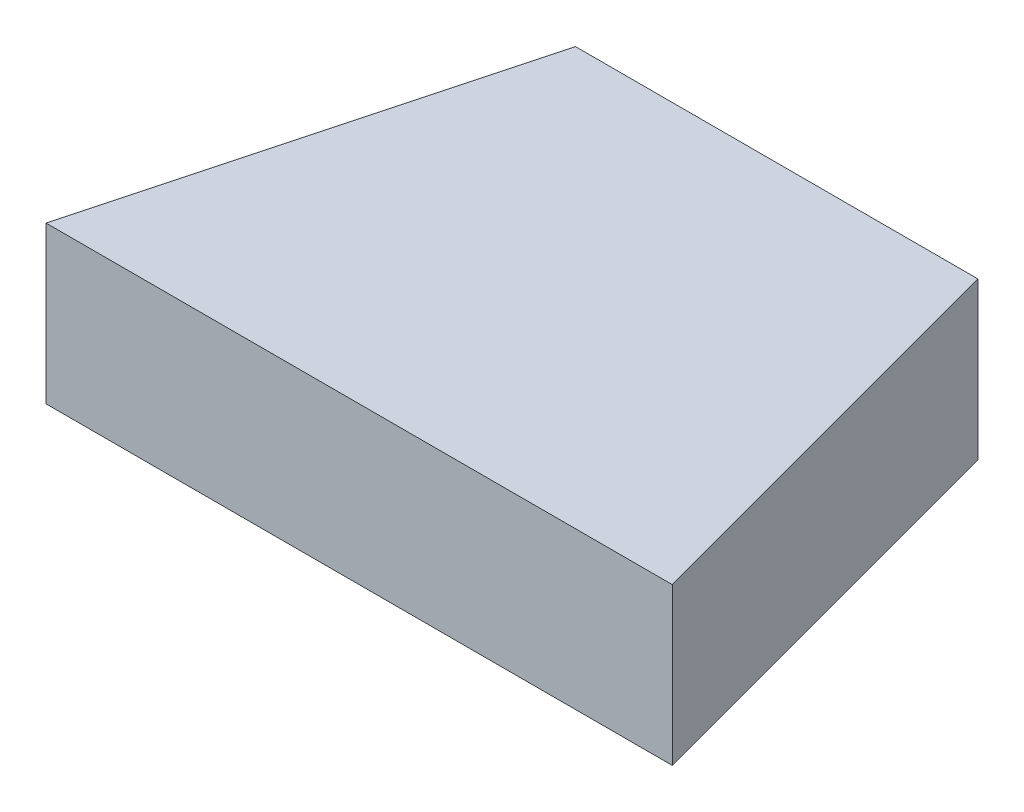
ISO-10303-21;
HEADER;
FILE_DESCRIPTION(('STEP AP214'),'2;1');
FILE_NAME('part.step','',(''),(''),'','','');
FILE_SCHEMA(('AUTOMOTIVE_DESIGN { 1 0 10303 214 1 1 1 1 }'));
ENDSEC;
DATA;
#1=APPLICATION_CONTEXT('core data for automotive mechanical design processes');
#2=APPLICATION_PROTOCOL_DEFINITION('international standard','automotive_design',2000,#1);
#3=PRODUCT_CONTEXT('',#1,'mechanical');
#4=PRODUCT('Part','Part','',(#3));
#5=PRODUCT_RELATED_PRODUCT_CATEGORY('part','',(#4));
#6=PRODUCT_DEFINITION_FORMATION('','',#4);
#7=PRODUCT_DEFINITION_CONTEXT('part definition',#1,'design');
#8=PRODUCT_DEFINITION('design','',#6,#7);
#9=PRODUCT_DEFINITION_SHAPE('','',#8);
#10=(LENGTH_UNIT() NAMED_UNIT(*) SI_UNIT(.MILLI.,.METRE.));
#11=(NAMED_UNIT(*) PLANE_ANGLE_UNIT() SI_UNIT($,.RADIAN.));
#12=(NAMED_UNIT(*) SI_UNIT($,.STERADIAN.) SOLID_ANGLE_UNIT());
#13=UNCERTAINTY_MEASURE_WITH_UNIT(LENGTH_MEASURE(1.E-05),#10,'distance_accuracy_value','');
#14=(GEOMETRIC_REPRESENTATION_CONTEXT(3) GLOBAL_UNCERTAINTY_ASSIGNED_CONTEXT((#13)) GLOBAL_UNIT_ASSIGNED_CONTEXT((#10,
#11,#12)) REPRESENTATION_CONTEXT('',''));
#15=CARTESIAN_POINT('',(0.,0.,0.));
#16=DIRECTION('',(0.,0.,1.));
#17=DIRECTION('',(1.,0.,0.));
#18=AXIS2_PLACEMENT_3D('',#15,#16,#17);
#19=CARTESIAN_POINT('',(-24.4881810244989,19.05,91.3911357683743));
#20=DIRECTION('',(0.965925826289068,0.,0.258819045102522));
#21=DIRECTION('',(0.258819045102522,0.,-0.965925826289068));
#22=AXIS2_PLACEMENT_3D('',#19,#20,#21);
#23=PLANE('',#22);
#24=DIRECTION('',(-0.258819045102522,0.,0.965925826289068));
#25=VECTOR('',#24,1.);
#26=CARTESIAN_POINT('',(-24.4881810244989,0.,91.3911357683743));
#27=LINE('',#26,#25);
#28=CARTESIAN_POINT('',(-24.4881810244989,0.,91.3911357683743));
#29=VERTEX_POINT('',#28);
#30=CARTESIAN_POINT('',(-38.1,0.,142.191135768374));
#31=VERTEX_POINT('',#30);
#32=EDGE_CURVE('E96',#29,#31,#27,.T.);
#33=ORIENTED_EDGE('',*,*,#32,.T.);
#34=DIRECTION('',(0.,-1.,0.));
#35=VECTOR('',#34,1.);
#36=CARTESIAN_POINT('',(-38.1,19.05,142.191135768374));
#37=LINE('',#36,#35);
#38=CARTESIAN_POINT('',(-38.1,19.05,142.191135768374));
#39=VERTEX_POINT('',#38);
#40=EDGE_CURVE('E11',#39,#31,#37,.T.);
#41=ORIENTED_EDGE('',*,*,#40,.F.);
#42=DIRECTION('',(-0.258819045102522,0.,0.965925826289068));
#43=VECTOR('',#42,1.);
#44=CARTESIAN_POINT('',(-24.4881810244989,19.05,91.3911357683743));
#45=LINE('',#44,#43);
#46=CARTESIAN_POINT('',(-24.4881810244989,19.05,91.3911357683743));
#47=VERTEX_POINT('',#46);
#48=EDGE_CURVE('E84',#47,#39,#45,.T.);
#49=ORIENTED_EDGE('',*,*,#48,.F.);
#50=DIRECTION('',(0.,-1.,0.));
#51=VECTOR('',#50,1.);
#52=CARTESIAN_POINT('',(-24.4881810244989,19.05,91.3911357683743));
#53=LINE('',#52,#51);
#54=EDGE_CURVE('E92',#47,#29,#53,.T.);
#55=ORIENTED_EDGE('',*,*,#54,.T.);
#56=EDGE_LOOP('',(#33,#41,#49,#55));
#57=FACE_BOUND('',#56,.T.);
#58=ADVANCED_FACE('F33',(#57),#23,.F.);
#59=CARTESIAN_POINT('',(-38.1,19.05,142.191135768374));
#60=DIRECTION('',(0.,0.,-1.));
#61=DIRECTION('',(-1.,0.,0.));
#62=AXIS2_PLACEMENT_3D('',#59,#60,#61);
#63=PLANE('',#62);
#64=DIRECTION('',(1.,0.,0.));
#65=VECTOR('',#64,1.);
#66=CARTESIAN_POINT('',(-38.1,0.,142.191135768374));
#67=LINE('',#66,#65);
#68=CARTESIAN_POINT('',(38.1,0.,142.191135768374));
#69=VERTEX_POINT('',#68);
#70=EDGE_CURVE('E88',#31,#69,#67,.T.);
#71=ORIENTED_EDGE('',*,*,#70,.T.);
#72=DIRECTION('',(0.,-1.,0.));
#73=VECTOR('',#72,1.);
#74=CARTESIAN_POINT('',(38.1,19.05,142.191135768374));
#75=LINE('',#74,#73);
#76=CARTESIAN_POINT('',(38.1,19.05,142.191135768374));
#77=VERTEX_POINT('',#76);
#78=EDGE_CURVE('E41',#77,#69,#75,.T.);
#79=ORIENTED_EDGE('',*,*,#78,.F.);
#80=DIRECTION('',(1.,0.,0.));
#81=VECTOR('',#80,1.);
#82=CARTESIAN_POINT('',(-38.1,19.05,142.191135768374));
#83=LINE('',#82,#81);
#84=EDGE_CURVE('E79',#39,#77,#83,.T.);
#85=ORIENTED_EDGE('',*,*,#84,.F.);
#86=ORIENTED_EDGE('',*,*,#40,.T.);
#87=EDGE_LOOP('',(#71,#79,#85,#86));
#88=FACE_BOUND('',#87,.T.);
#89=ADVANCED_FACE('F87',(#88),#63,.F.);
#90=CARTESIAN_POINT('',(24.488181024499,19.05,91.3911357683743));
#91=DIRECTION('',(-0.965925826289068,0.,0.258819045102521));
#92=DIRECTION('',(0.258819045102521,0.,0.965925826289068));
#93=AXIS2_PLACEMENT_3D('',#90,#91,#92);
#94=PLANE('',#93);
#95=DIRECTION('',(-0.258819045102521,0.,-0.965925826289068));
#96=VECTOR('',#95,1.);
#97=CARTESIAN_POINT('',(24.488181024499,0.,91.3911357683743));
#98=LINE('',#97,#96);
#99=CARTESIAN_POINT('',(24.488181024499,0.,91.3911357683743));
#100=VERTEX_POINT('',#99);
#101=EDGE_CURVE('E66',#69,#100,#98,.T.);
#102=ORIENTED_EDGE('',*,*,#101,.T.);
#103=DIRECTION('',(0.,-1.,0.));
#104=VECTOR('',#103,1.);
#105=CARTESIAN_POINT('',(24.488181024499,19.05,91.3911357683743));
#106=LINE('',#105,#104);
#107=CARTESIAN_POINT('',(24.488181024499,19.05,91.3911357683743));
#108=VERTEX_POINT('',#107);
#109=EDGE_CURVE('E89',#108,#100,#106,.T.);
#110=ORIENTED_EDGE('',*,*,#109,.F.);
#111=DIRECTION('',(-0.258819045102521,0.,-0.965925826289068));
#112=VECTOR('',#111,1.);
#113=CARTESIAN_POINT('',(24.488181024499,19.05,91.3911357683743));
#114=LINE('',#113,#112);
#115=EDGE_CURVE('E82',#77,#108,#114,.T.);
#116=ORIENTED_EDGE('',*,*,#115,.F.);
#117=ORIENTED_EDGE('',*,*,#78,.T.);
#118=EDGE_LOOP('',(#102,#110,#116,#117));
#119=FACE_BOUND('',#118,.T.);
#120=ADVANCED_FACE('F90',(#119),#94,.F.);
#121=CARTESIAN_POINT('',(-24.4881810244989,19.05,91.3911357683743));
#122=DIRECTION('',(0.,0.,1.));
#123=DIRECTION('',(1.,0.,0.));
#124=AXIS2_PLACEMENT_3D('',#121,#122,#123);
#125=PLANE('',#124);
#126=DIRECTION('',(-1.,0.,0.));
#127=VECTOR('',#126,1.);
#128=CARTESIAN_POINT('',(-24.4881810244989,0.,91.3911357683743));
#129=LINE('',#128,#127);
#130=EDGE_CURVE('E72',#100,#29,#129,.T.);
#131=ORIENTED_EDGE('',*,*,#130,.T.);
#132=ORIENTED_EDGE('',*,*,#54,.F.);
#133=DIRECTION('',(-1.,0.,0.));
#134=VECTOR('',#133,1.);
#135=CARTESIAN_POINT('',(-24.4881810244989,19.05,91.3911357683743));
#136=LINE('',#135,#134);
#137=EDGE_CURVE('E49',#108,#47,#136,.T.);
#138=ORIENTED_EDGE('',*,*,#137,.F.);
#139=ORIENTED_EDGE('',*,*,#109,.T.);
#140=EDGE_LOOP('',(#131,#132,#138,#139));
#141=FACE_BOUND('',#140,.T.);
#142=ADVANCED_FACE('F103',(#141),#125,.F.);
#143=CARTESIAN_POINT('',(0.,19.05,0.));
#144=DIRECTION('',(0.,1.,0.));
#145=DIRECTION('',(0.,0.,1.));
#146=AXIS2_PLACEMENT_3D('',#143,#144,#145);
#147=PLANE('',#146);
#148=ORIENTED_EDGE('',*,*,#48,.T.);
#149=ORIENTED_EDGE('',*,*,#84,.T.);
#150=ORIENTED_EDGE('',*,*,#115,.T.);
#151=ORIENTED_EDGE('',*,*,#137,.T.);
#152=EDGE_LOOP('',(#148,#149,#150,#151));
#153=FACE_BOUND('',#152,.T.);
#154=ADVANCED_FACE('F80',(#153),#147,.T.);
#155=CARTESIAN_POINT('',(0.,0.,0.));
#156=DIRECTION('',(0.,1.,0.));
#157=DIRECTION('',(0.,0.,1.));
#158=AXIS2_PLACEMENT_3D('',#155,#156,#157);
#159=PLANE('',#158);
#160=ORIENTED_EDGE('',*,*,#32,.F.);
#161=ORIENTED_EDGE('',*,*,#130,.F.);
#162=ORIENTED_EDGE('',*,*,#101,.F.);
#163=ORIENTED_EDGE('',*,*,#70,.F.);
#164=EDGE_LOOP('',(#160,#161,#162,#163));
#165=FACE_BOUND('',#164,.T.);
#166=ADVANCED_FACE('F106',(#165),#159,.F.);
#167=CLOSED_SHELL('',(#58,#89,#120,#142,#154,#166));
#168=MANIFOLD_SOLID_BREP('B2',#167);
#169=ADVANCED_BREP_SHAPE_REPRESENTATION('',(#18,#168),#14);
#170=SHAPE_DEFINITION_REPRESENTATION(#9,#169);
ENDSEC;
END-ISO-10303-21;
